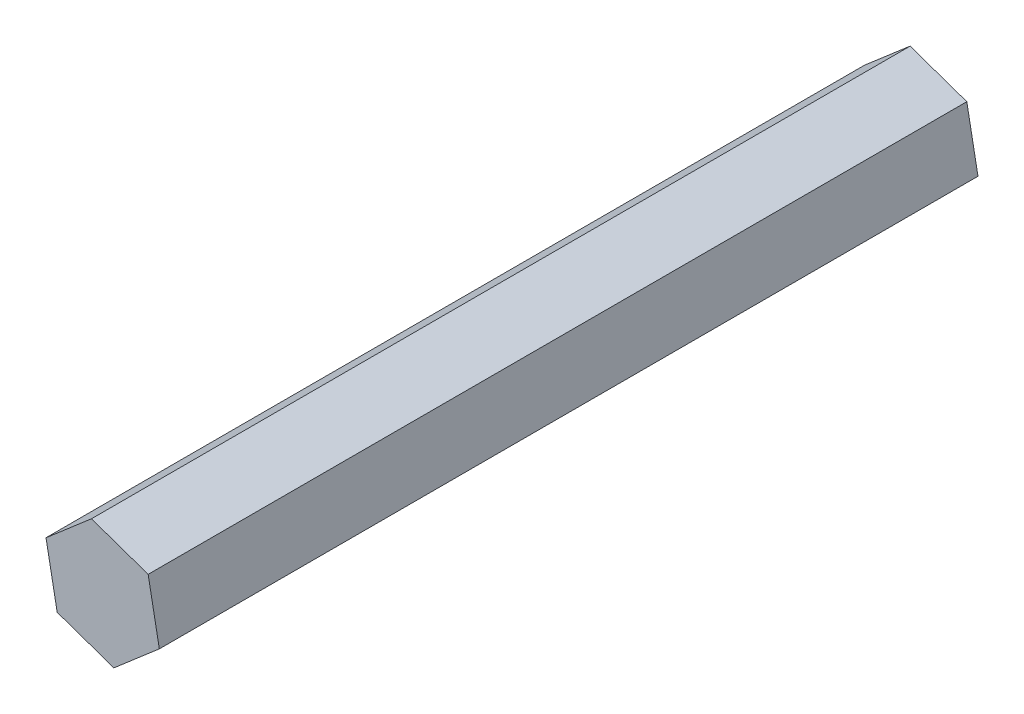
ISO-10303-21;
HEADER;
FILE_DESCRIPTION(('STEP AP214'),'2;1');
FILE_NAME('part.step','',(''),(''),'','','');
FILE_SCHEMA(('AUTOMOTIVE_DESIGN { 1 0 10303 214 1 1 1 1 }'));
ENDSEC;
DATA;
#1=APPLICATION_CONTEXT('core data for automotive mechanical design processes');
#2=APPLICATION_PROTOCOL_DEFINITION('international standard','automotive_design',2000,#1);
#3=PRODUCT_CONTEXT('',#1,'mechanical');
#4=PRODUCT('Part','Part','',(#3));
#5=PRODUCT_RELATED_PRODUCT_CATEGORY('part','',(#4));
#6=PRODUCT_DEFINITION_FORMATION('','',#4);
#7=PRODUCT_DEFINITION_CONTEXT('part definition',#1,'design');
#8=PRODUCT_DEFINITION('design','',#6,#7);
#9=PRODUCT_DEFINITION_SHAPE('','',#8);
#10=(LENGTH_UNIT() NAMED_UNIT(*) SI_UNIT(.MILLI.,.METRE.));
#11=(NAMED_UNIT(*) PLANE_ANGLE_UNIT() SI_UNIT($,.RADIAN.));
#12=(NAMED_UNIT(*) SI_UNIT($,.STERADIAN.) SOLID_ANGLE_UNIT());
#13=UNCERTAINTY_MEASURE_WITH_UNIT(LENGTH_MEASURE(1.E-05),#10,'distance_accuracy_value','');
#14=(GEOMETRIC_REPRESENTATION_CONTEXT(3) GLOBAL_UNCERTAINTY_ASSIGNED_CONTEXT((#13)) GLOBAL_UNIT_ASSIGNED_CONTEXT((#10,
#11,#12)) REPRESENTATION_CONTEXT('',''));
#15=CARTESIAN_POINT('',(0.,0.,0.));
#16=DIRECTION('',(0.,0.,1.));
#17=DIRECTION('',(1.,0.,0.));
#18=AXIS2_PLACEMENT_3D('',#15,#16,#17);
#19=CARTESIAN_POINT('',(6.92237432589748,-2.41745052182847,100.));
#20=DIRECTION('',(-0.982451578987529,-0.186517814014936,0.));
#21=DIRECTION('',(0.186517814014936,-0.98245157898753,0.));
#22=AXIS2_PLACEMENT_3D('',#19,#20,#21);
#23=PLANE('',#22);
#24=DIRECTION('',(-0.186517814014936,0.98245157898753,0.));
#25=VECTOR('',#24,1.);
#26=CARTESIAN_POINT('',(6.92237432589748,-2.41745052182847,0.));
#27=LINE('',#26,#25);
#28=CARTESIAN_POINT('',(6.92237432589748,-2.41745052182847,0.));
#29=VERTEX_POINT('',#28);
#30=CARTESIAN_POINT('',(5.55476072724415,4.78622675981816,0.));
#31=VERTEX_POINT('',#30);
#32=EDGE_CURVE('E116',#29,#31,#27,.T.);
#33=ORIENTED_EDGE('',*,*,#32,.T.);
#34=DIRECTION('',(0.,0.,-1.));
#35=VECTOR('',#34,1.);
#36=CARTESIAN_POINT('',(5.55476072724415,4.78622675981816,100.));
#37=LINE('',#36,#35);
#38=CARTESIAN_POINT('',(5.55476072724415,4.78622675981816,100.));
#39=VERTEX_POINT('',#38);
#40=EDGE_CURVE('E11',#39,#31,#37,.T.);
#41=ORIENTED_EDGE('',*,*,#40,.F.);
#42=DIRECTION('',(-0.186517814014936,0.98245157898753,0.));
#43=VECTOR('',#42,1.);
#44=CARTESIAN_POINT('',(6.92237432589748,-2.41745052182847,100.));
#45=LINE('',#44,#43);
#46=CARTESIAN_POINT('',(6.92237432589748,-2.41745052182847,100.));
#47=VERTEX_POINT('',#46);
#48=EDGE_CURVE('E126',#47,#39,#45,.T.);
#49=ORIENTED_EDGE('',*,*,#48,.F.);
#50=DIRECTION('',(0.,0.,-1.));
#51=VECTOR('',#50,1.);
#52=CARTESIAN_POINT('',(6.92237432589748,-2.41745052182847,100.));
#53=LINE('',#52,#51);
#54=EDGE_CURVE('E112',#47,#29,#53,.T.);
#55=ORIENTED_EDGE('',*,*,#54,.T.);
#56=EDGE_LOOP('',(#33,#41,#49,#55));
#57=FACE_BOUND('',#56,.T.);
#58=ADVANCED_FACE('F32',(#57),#23,.F.);
#59=CARTESIAN_POINT('',(5.55476072724415,4.78622675981816,100.));
#60=DIRECTION('',(-0.32969662429849,-0.944086932398802,0.));
#61=DIRECTION('',(0.944086932398802,-0.32969662429849,0.));
#62=AXIS2_PLACEMENT_3D('',#59,#60,#61);
#63=PLANE('',#62);
#64=DIRECTION('',(-0.944086932398802,0.32969662429849,0.));
#65=VECTOR('',#64,1.);
#66=CARTESIAN_POINT('',(5.55476072724415,4.78622675981816,0.));
#67=LINE('',#66,#65);
#68=CARTESIAN_POINT('',(-1.36761359865333,7.20367728164663,0.));
#69=VERTEX_POINT('',#68);
#70=EDGE_CURVE('E119',#31,#69,#67,.T.);
#71=ORIENTED_EDGE('',*,*,#70,.T.);
#72=DIRECTION('',(0.,0.,-1.));
#73=VECTOR('',#72,1.);
#74=CARTESIAN_POINT('',(-1.36761359865333,7.20367728164663,100.));
#75=LINE('',#74,#73);
#76=CARTESIAN_POINT('',(-1.36761359865333,7.20367728164663,100.));
#77=VERTEX_POINT('',#76);
#78=EDGE_CURVE('E40',#77,#69,#75,.T.);
#79=ORIENTED_EDGE('',*,*,#78,.F.);
#80=DIRECTION('',(-0.944086932398802,0.32969662429849,0.));
#81=VECTOR('',#80,1.);
#82=CARTESIAN_POINT('',(5.55476072724415,4.78622675981816,100.));
#83=LINE('',#82,#81);
#84=EDGE_CURVE('E85',#39,#77,#83,.T.);
#85=ORIENTED_EDGE('',*,*,#84,.F.);
#86=ORIENTED_EDGE('',*,*,#40,.T.);
#87=EDGE_LOOP('',(#71,#79,#85,#86));
#88=FACE_BOUND('',#87,.T.);
#89=ADVANCED_FACE('F150',(#88),#63,.F.);
#90=CARTESIAN_POINT('',(-1.36761359865333,7.20367728164663,100.));
#91=DIRECTION('',(0.65275495468904,-0.757569118383866,0.));
#92=DIRECTION('',(0.757569118383867,0.652754954689041,0.));
#93=AXIS2_PLACEMENT_3D('',#90,#91,#92);
#94=PLANE('',#93);
#95=DIRECTION('',(-0.757569118383866,-0.65275495468904,0.));
#96=VECTOR('',#95,1.);
#97=CARTESIAN_POINT('',(-1.36761359865333,7.20367728164663,0.));
#98=LINE('',#97,#96);
#99=CARTESIAN_POINT('',(-6.92237432589747,2.41745052182847,0.));
#100=VERTEX_POINT('',#99);
#101=EDGE_CURVE('E121',#69,#100,#98,.T.);
#102=ORIENTED_EDGE('',*,*,#101,.T.);
#103=DIRECTION('',(0.,0.,-1.));
#104=VECTOR('',#103,1.);
#105=CARTESIAN_POINT('',(-6.92237432589747,2.41745052182847,100.));
#106=LINE('',#105,#104);
#107=CARTESIAN_POINT('',(-6.92237432589747,2.41745052182847,100.));
#108=VERTEX_POINT('',#107);
#109=EDGE_CURVE('E107',#108,#100,#106,.T.);
#110=ORIENTED_EDGE('',*,*,#109,.F.);
#111=DIRECTION('',(-0.757569118383866,-0.65275495468904,0.));
#112=VECTOR('',#111,1.);
#113=CARTESIAN_POINT('',(-1.36761359865333,7.20367728164663,100.));
#114=LINE('',#113,#112);
#115=EDGE_CURVE('E98',#77,#108,#114,.T.);
#116=ORIENTED_EDGE('',*,*,#115,.F.);
#117=ORIENTED_EDGE('',*,*,#78,.T.);
#118=EDGE_LOOP('',(#102,#110,#116,#117));
#119=FACE_BOUND('',#118,.T.);
#120=ADVANCED_FACE('F132',(#119),#94,.F.);
#121=CARTESIAN_POINT('',(-6.92237432589747,2.41745052182847,100.));
#122=DIRECTION('',(0.982451578987529,0.186517814014936,0.));
#123=DIRECTION('',(-0.186517814014936,0.982451578987529,0.));
#124=AXIS2_PLACEMENT_3D('',#121,#122,#123);
#125=PLANE('',#124);
#126=DIRECTION('',(0.186517814014936,-0.98245157898753,0.));
#127=VECTOR('',#126,1.);
#128=CARTESIAN_POINT('',(-6.92237432589747,2.41745052182847,0.));
#129=LINE('',#128,#127);
#130=CARTESIAN_POINT('',(-5.55476072724414,-4.78622675981816,0.));
#131=VERTEX_POINT('',#130);
#132=EDGE_CURVE('E106',#100,#131,#129,.T.);
#133=ORIENTED_EDGE('',*,*,#132,.T.);
#134=DIRECTION('',(0.,0.,-1.));
#135=VECTOR('',#134,1.);
#136=CARTESIAN_POINT('',(-5.55476072724414,-4.78622675981816,100.));
#137=LINE('',#136,#135);
#138=CARTESIAN_POINT('',(-5.55476072724414,-4.78622675981816,100.));
#139=VERTEX_POINT('',#138);
#140=EDGE_CURVE('E103',#139,#131,#137,.T.);
#141=ORIENTED_EDGE('',*,*,#140,.F.);
#142=DIRECTION('',(0.186517814014936,-0.98245157898753,0.));
#143=VECTOR('',#142,1.);
#144=CARTESIAN_POINT('',(-6.92237432589747,2.41745052182847,100.));
#145=LINE('',#144,#143);
#146=EDGE_CURVE('E92',#108,#139,#145,.T.);
#147=ORIENTED_EDGE('',*,*,#146,.F.);
#148=ORIENTED_EDGE('',*,*,#109,.T.);
#149=EDGE_LOOP('',(#133,#141,#147,#148));
#150=FACE_BOUND('',#149,.T.);
#151=ADVANCED_FACE('F104',(#150),#125,.F.);
#152=CARTESIAN_POINT('',(-5.55476072724414,-4.78622675981816,100.));
#153=DIRECTION('',(0.32969662429849,0.944086932398802,0.));
#154=DIRECTION('',(-0.944086932398802,0.32969662429849,0.));
#155=AXIS2_PLACEMENT_3D('',#152,#153,#154);
#156=PLANE('',#155);
#157=DIRECTION('',(0.944086932398802,-0.32969662429849,0.));
#158=VECTOR('',#157,1.);
#159=CARTESIAN_POINT('',(-5.55476072724414,-4.78622675981816,0.));
#160=LINE('',#159,#158);
#161=CARTESIAN_POINT('',(1.36761359865333,-7.20367728164663,0.));
#162=VERTEX_POINT('',#161);
#163=EDGE_CURVE('E71',#131,#162,#160,.T.);
#164=ORIENTED_EDGE('',*,*,#163,.T.);
#165=DIRECTION('',(0.,0.,-1.));
#166=VECTOR('',#165,1.);
#167=CARTESIAN_POINT('',(1.36761359865333,-7.20367728164663,100.));
#168=LINE('',#167,#166);
#169=CARTESIAN_POINT('',(1.36761359865333,-7.20367728164663,100.));
#170=VERTEX_POINT('',#169);
#171=EDGE_CURVE('E108',#170,#162,#168,.T.);
#172=ORIENTED_EDGE('',*,*,#171,.F.);
#173=DIRECTION('',(0.944086932398802,-0.32969662429849,0.));
#174=VECTOR('',#173,1.);
#175=CARTESIAN_POINT('',(-5.55476072724414,-4.78622675981816,100.));
#176=LINE('',#175,#174);
#177=EDGE_CURVE('E96',#139,#170,#176,.T.);
#178=ORIENTED_EDGE('',*,*,#177,.F.);
#179=ORIENTED_EDGE('',*,*,#140,.T.);
#180=EDGE_LOOP('',(#164,#172,#178,#179));
#181=FACE_BOUND('',#180,.T.);
#182=ADVANCED_FACE('F110',(#181),#156,.F.);
#183=CARTESIAN_POINT('',(1.36761359865333,-7.20367728164663,100.));
#184=DIRECTION('',(-0.65275495468904,0.757569118383867,0.));
#185=DIRECTION('',(-0.757569118383867,-0.65275495468904,0.));
#186=AXIS2_PLACEMENT_3D('',#183,#184,#185);
#187=PLANE('',#186);
#188=DIRECTION('',(0.757569118383867,0.65275495468904,0.));
#189=VECTOR('',#188,1.);
#190=CARTESIAN_POINT('',(1.36761359865333,-7.20367728164663,0.));
#191=LINE('',#190,#189);
#192=EDGE_CURVE('E77',#162,#29,#191,.T.);
#193=ORIENTED_EDGE('',*,*,#192,.T.);
#194=ORIENTED_EDGE('',*,*,#54,.F.);
#195=DIRECTION('',(0.757569118383867,0.65275495468904,0.));
#196=VECTOR('',#195,1.);
#197=CARTESIAN_POINT('',(1.36761359865333,-7.20367728164663,100.));
#198=LINE('',#197,#196);
#199=EDGE_CURVE('E48',#170,#47,#198,.T.);
#200=ORIENTED_EDGE('',*,*,#199,.F.);
#201=ORIENTED_EDGE('',*,*,#171,.T.);
#202=EDGE_LOOP('',(#193,#194,#200,#201));
#203=FACE_BOUND('',#202,.T.);
#204=ADVANCED_FACE('F139',(#203),#187,.F.);
#205=CARTESIAN_POINT('',(0.,0.,100.));
#206=DIRECTION('',(0.,0.,1.));
#207=DIRECTION('',(1.,0.,0.));
#208=AXIS2_PLACEMENT_3D('',#205,#206,#207);
#209=PLANE('',#208);
#210=ORIENTED_EDGE('',*,*,#48,.T.);
#211=ORIENTED_EDGE('',*,*,#84,.T.);
#212=ORIENTED_EDGE('',*,*,#115,.T.);
#213=ORIENTED_EDGE('',*,*,#146,.T.);
#214=ORIENTED_EDGE('',*,*,#177,.T.);
#215=ORIENTED_EDGE('',*,*,#199,.T.);
#216=EDGE_LOOP('',(#210,#211,#212,#213,#214,#215));
#217=FACE_BOUND('',#216,.T.);
#218=ADVANCED_FACE('F94',(#217),#209,.T.);
#219=CARTESIAN_POINT('',(0.,0.,0.));
#220=DIRECTION('',(0.,0.,1.));
#221=DIRECTION('',(1.,0.,0.));
#222=AXIS2_PLACEMENT_3D('',#219,#220,#221);
#223=PLANE('',#222);
#224=ORIENTED_EDGE('',*,*,#32,.F.);
#225=ORIENTED_EDGE('',*,*,#192,.F.);
#226=ORIENTED_EDGE('',*,*,#163,.F.);
#227=ORIENTED_EDGE('',*,*,#132,.F.);
#228=ORIENTED_EDGE('',*,*,#101,.F.);
#229=ORIENTED_EDGE('',*,*,#70,.F.);
#230=EDGE_LOOP('',(#224,#225,#226,#227,#228,#229));
#231=FACE_BOUND('',#230,.T.);
#232=ADVANCED_FACE('F135',(#231),#223,.F.);
#233=CLOSED_SHELL('',(#58,#89,#120,#151,#182,#204,#218,#232));
#234=MANIFOLD_SOLID_BREP('B2',#233);
#235=ADVANCED_BREP_SHAPE_REPRESENTATION('',(#18,#234),#14);
#236=SHAPE_DEFINITION_REPRESENTATION(#9,#235);
ENDSEC;
END-ISO-10303-21;
